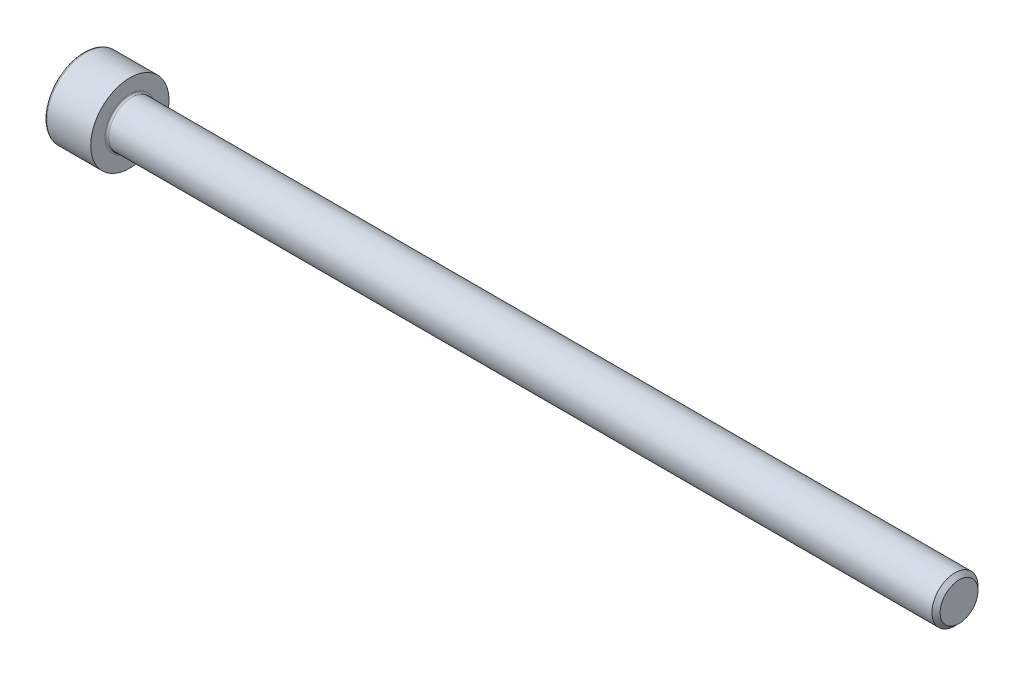
ISO-10303-21;
HEADER;
FILE_DESCRIPTION(('STEP AP214'),'2;1');
FILE_NAME('part.step','',(''),(''),'','','');
FILE_SCHEMA(('AUTOMOTIVE_DESIGN { 1 0 10303 214 1 1 1 1 }'));
ENDSEC;
DATA;
#1=APPLICATION_CONTEXT('core data for automotive mechanical design processes');
#2=APPLICATION_PROTOCOL_DEFINITION('international standard','automotive_design',2000,#1);
#3=PRODUCT_CONTEXT('',#1,'mechanical');
#4=PRODUCT('Part','Part','',(#3));
#5=PRODUCT_RELATED_PRODUCT_CATEGORY('part','',(#4));
#6=PRODUCT_DEFINITION_FORMATION('','',#4);
#7=PRODUCT_DEFINITION_CONTEXT('part definition',#1,'design');
#8=PRODUCT_DEFINITION('design','',#6,#7);
#9=PRODUCT_DEFINITION_SHAPE('','',#8);
#10=(LENGTH_UNIT() NAMED_UNIT(*) SI_UNIT(.MILLI.,.METRE.));
#11=(NAMED_UNIT(*) PLANE_ANGLE_UNIT() SI_UNIT($,.RADIAN.));
#12=(NAMED_UNIT(*) SI_UNIT($,.STERADIAN.) SOLID_ANGLE_UNIT());
#13=UNCERTAINTY_MEASURE_WITH_UNIT(LENGTH_MEASURE(1.E-05),#10,'distance_accuracy_value','');
#14=(GEOMETRIC_REPRESENTATION_CONTEXT(3) GLOBAL_UNCERTAINTY_ASSIGNED_CONTEXT((#13)) GLOBAL_UNIT_ASSIGNED_CONTEXT((#10,
#11,#12)) REPRESENTATION_CONTEXT('',''));
#15=CARTESIAN_POINT('',(0.,0.,0.));
#16=DIRECTION('',(0.,0.,1.));
#17=DIRECTION('',(1.,0.,0.));
#18=AXIS2_PLACEMENT_3D('',#15,#16,#17);
#19=CARTESIAN_POINT('',(0.,0.,0.));
#20=DIRECTION('',(-1.,0.,0.));
#21=DIRECTION('',(0.,0.,1.));
#22=AXIS2_PLACEMENT_3D('',#19,#20,#21);
#23=PLANE('',#22);
#24=DIRECTION('',(0.,-0.499999999999999,0.866025403784439));
#25=VECTOR('',#24,1.);
#26=CARTESIAN_POINT('',(0.,2.35789849937043,0.));
#27=LINE('',#26,#25);
#28=CARTESIAN_POINT('',(0.,2.35789849937043,0.));
#29=VERTEX_POINT('',#28);
#30=CARTESIAN_POINT('',(0.,1.17894924968522,2.042));
#31=VERTEX_POINT('',#30);
#32=EDGE_CURVE('E377',#29,#31,#27,.T.);
#33=ORIENTED_EDGE('',*,*,#32,.T.);
#34=DIRECTION('',(0.,1.,0.));
#35=VECTOR('',#34,1.);
#36=CARTESIAN_POINT('',(0.,-1.17894924968522,2.042));
#37=LINE('',#36,#35);
#38=CARTESIAN_POINT('',(0.,-1.17894924968522,2.042));
#39=VERTEX_POINT('',#38);
#40=EDGE_CURVE('E126',#39,#31,#37,.T.);
#41=ORIENTED_EDGE('',*,*,#40,.F.);
#42=DIRECTION('',(0.,-0.500000000000001,-0.866025403784438));
#43=VECTOR('',#42,1.);
#44=CARTESIAN_POINT('',(0.,-1.17894924968522,2.042));
#45=LINE('',#44,#43);
#46=CARTESIAN_POINT('',(0.,-2.35789849937043,0.));
#47=VERTEX_POINT('',#46);
#48=EDGE_CURVE('E380',#39,#47,#45,.T.);
#49=ORIENTED_EDGE('',*,*,#48,.T.);
#50=DIRECTION('',(0.,0.499999999999999,-0.866025403784439));
#51=VECTOR('',#50,1.);
#52=CARTESIAN_POINT('',(0.,-2.35789849937043,0.));
#53=LINE('',#52,#51);
#54=CARTESIAN_POINT('',(0.,-1.17894924968522,-2.042));
#55=VERTEX_POINT('',#54);
#56=EDGE_CURVE('E383',#47,#55,#53,.T.);
#57=ORIENTED_EDGE('',*,*,#56,.T.);
#58=DIRECTION('',(0.,-1.,0.));
#59=VECTOR('',#58,1.);
#60=CARTESIAN_POINT('',(0.,1.17894924968521,-2.042));
#61=LINE('',#60,#59);
#62=CARTESIAN_POINT('',(0.,1.17894924968521,-2.042));
#63=VERTEX_POINT('',#62);
#64=EDGE_CURVE('E386',#63,#55,#61,.T.);
#65=ORIENTED_EDGE('',*,*,#64,.F.);
#66=DIRECTION('',(0.,-0.500000000000001,-0.866025403784438));
#67=VECTOR('',#66,1.);
#68=CARTESIAN_POINT('',(0.,2.35789849937043,0.));
#69=LINE('',#68,#67);
#70=EDGE_CURVE('E121',#29,#63,#69,.T.);
#71=ORIENTED_EDGE('',*,*,#70,.F.);
#72=EDGE_LOOP('',(#33,#41,#49,#57,#65,#71));
#73=FACE_BOUND('',#72,.T.);
#74=CARTESIAN_POINT('',(0.,0.,0.));
#75=DIRECTION('',(-1.,0.,0.));
#76=DIRECTION('',(0.,0.,1.));
#77=AXIS2_PLACEMENT_3D('',#74,#75,#76);
#78=CIRCLE('',#77,4.);
#79=CARTESIAN_POINT('',(0.,0.,4.));
#80=VERTEX_POINT('',#79);
#81=EDGE_CURVE('E42',#80,#80,#78,.T.);
#82=ORIENTED_EDGE('',*,*,#81,.T.);
#83=EDGE_LOOP('',(#82));
#84=FACE_BOUND('',#83,.T.);
#85=ADVANCED_FACE('F34',(#73,#84),#23,.T.);
#86=CARTESIAN_POINT('',(95.,2.055,0.));
#87=DIRECTION('',(1.,0.,0.));
#88=DIRECTION('',(0.,0.,-1.));
#89=AXIS2_PLACEMENT_3D('',#86,#87,#88);
#90=PLANE('',#89);
#91=CARTESIAN_POINT('',(95.,0.,0.));
#92=DIRECTION('',(-1.,0.,0.));
#93=DIRECTION('',(0.,0.,1.));
#94=AXIS2_PLACEMENT_3D('',#91,#92,#93);
#95=CIRCLE('',#94,2.055);
#96=CARTESIAN_POINT('',(95.,0.,2.055));
#97=VERTEX_POINT('',#96);
#98=EDGE_CURVE('E144',#97,#97,#95,.T.);
#99=ORIENTED_EDGE('',*,*,#98,.F.);
#100=EDGE_LOOP('',(#99));
#101=FACE_BOUND('',#100,.T.);
#102=ADVANCED_FACE('F168',(#101),#90,.T.);
#103=CARTESIAN_POINT('',(95.,0.,0.));
#104=DIRECTION('',(-1.,0.,0.));
#105=DIRECTION('',(0.,0.,1.));
#106=AXIS2_PLACEMENT_3D('',#103,#104,#105);
#107=CONICAL_SURFACE('',#106,2.055,0.78539816339745);
#108=CARTESIAN_POINT('',(94.555,0.,0.));
#109=DIRECTION('',(-1.,0.,0.));
#110=DIRECTION('',(0.,0.,1.));
#111=AXIS2_PLACEMENT_3D('',#108,#109,#110);
#112=CIRCLE('',#111,2.5);
#113=CARTESIAN_POINT('',(94.555,0.,2.5));
#114=VERTEX_POINT('',#113);
#115=EDGE_CURVE('E141',#114,#114,#112,.T.);
#116=ORIENTED_EDGE('',*,*,#115,.F.);
#117=EDGE_LOOP('',(#116));
#118=FACE_BOUND('',#117,.T.);
#119=ORIENTED_EDGE('',*,*,#98,.T.);
#120=EDGE_LOOP('',(#119));
#121=FACE_BOUND('',#120,.T.);
#122=ADVANCED_FACE('F174',(#118,#121),#107,.T.);
#123=CARTESIAN_POINT('',(-31.75,0.,0.));
#124=DIRECTION('',(-1.,0.,0.));
#125=DIRECTION('',(0.,0.,1.));
#126=AXIS2_PLACEMENT_3D('',#123,#124,#125);
#127=CYLINDRICAL_SURFACE('',#126,2.5);
#128=CARTESIAN_POINT('',(5.2,0.,0.));
#129=DIRECTION('',(1.,0.,0.));
#130=DIRECTION('',(0.,0.,-1.));
#131=AXIS2_PLACEMENT_3D('',#128,#129,#130);
#132=CIRCLE('',#131,2.5);
#133=CARTESIAN_POINT('',(5.2,0.,-2.5));
#134=VERTEX_POINT('',#133);
#135=EDGE_CURVE('E150',#134,#134,#132,.T.);
#136=ORIENTED_EDGE('',*,*,#135,.T.);
#137=EDGE_LOOP('',(#136));
#138=FACE_BOUND('',#137,.T.);
#139=ORIENTED_EDGE('',*,*,#115,.T.);
#140=EDGE_LOOP('',(#139));
#141=FACE_BOUND('',#140,.T.);
#142=ADVANCED_FACE('F186',(#138,#141),#127,.T.);
#143=CARTESIAN_POINT('',(5.,4.25,0.));
#144=DIRECTION('',(1.,0.,0.));
#145=DIRECTION('',(0.,0.,-1.));
#146=AXIS2_PLACEMENT_3D('',#143,#144,#145);
#147=PLANE('',#146);
#148=CARTESIAN_POINT('',(5.,0.,0.));
#149=DIRECTION('',(1.,0.,0.));
#150=DIRECTION('',(0.,0.,-1.));
#151=AXIS2_PLACEMENT_3D('',#148,#149,#150);
#152=CIRCLE('',#151,2.7);
#153=CARTESIAN_POINT('',(5.,0.,-2.7));
#154=VERTEX_POINT('',#153);
#155=EDGE_CURVE('E147',#154,#154,#152,.F.);
#156=ORIENTED_EDGE('',*,*,#155,.T.);
#157=EDGE_LOOP('',(#156));
#158=FACE_BOUND('',#157,.T.);
#159=CARTESIAN_POINT('',(5.,0.,0.));
#160=DIRECTION('',(-1.,0.,0.));
#161=DIRECTION('',(0.,0.,1.));
#162=AXIS2_PLACEMENT_3D('',#159,#160,#161);
#163=CIRCLE('',#162,4.25);
#164=CARTESIAN_POINT('',(5.,0.,4.25));
#165=VERTEX_POINT('',#164);
#166=EDGE_CURVE('E137',#165,#165,#163,.T.);
#167=ORIENTED_EDGE('',*,*,#166,.F.);
#168=EDGE_LOOP('',(#167));
#169=FACE_BOUND('',#168,.T.);
#170=ADVANCED_FACE('F182',(#158,#169),#147,.T.);
#171=CARTESIAN_POINT('',(-31.75,0.,0.));
#172=DIRECTION('',(-1.,0.,0.));
#173=DIRECTION('',(0.,0.,1.));
#174=AXIS2_PLACEMENT_3D('',#171,#172,#173);
#175=CYLINDRICAL_SURFACE('',#174,4.25);
#176=CARTESIAN_POINT('',(0.25,0.,0.));
#177=DIRECTION('',(-1.,0.,0.));
#178=DIRECTION('',(0.,0.,1.));
#179=AXIS2_PLACEMENT_3D('',#176,#177,#178);
#180=CIRCLE('',#179,4.25);
#181=CARTESIAN_POINT('',(0.25,0.,4.25));
#182=VERTEX_POINT('',#181);
#183=EDGE_CURVE('E11',#182,#182,#180,.F.);
#184=ORIENTED_EDGE('',*,*,#183,.T.);
#185=EDGE_LOOP('',(#184));
#186=FACE_BOUND('',#185,.T.);
#187=ORIENTED_EDGE('',*,*,#166,.T.);
#188=EDGE_LOOP('',(#187));
#189=FACE_BOUND('',#188,.T.);
#190=ADVANCED_FACE('F164',(#186,#189),#175,.T.);
#191=CARTESIAN_POINT('',(5.2,0.,0.));
#192=DIRECTION('',(1.,0.,0.));
#193=DIRECTION('',(0.,0.,-1.));
#194=AXIS2_PLACEMENT_3D('',#191,#192,#193);
#195=TOROIDAL_SURFACE('',#194,2.7,0.2);
#196=ORIENTED_EDGE('',*,*,#135,.F.);
#197=EDGE_LOOP('',(#196));
#198=FACE_BOUND('',#197,.T.);
#199=ORIENTED_EDGE('',*,*,#155,.F.);
#200=EDGE_LOOP('',(#199));
#201=FACE_BOUND('',#200,.T.);
#202=ADVANCED_FACE('F157',(#198,#201),#195,.F.);
#203=CARTESIAN_POINT('',(0.25,0.,0.));
#204=DIRECTION('',(-1.,0.,0.));
#205=DIRECTION('',(0.,0.,1.));
#206=AXIS2_PLACEMENT_3D('',#203,#204,#205);
#207=TOROIDAL_SURFACE('',#206,4.,0.25);
#208=ORIENTED_EDGE('',*,*,#183,.F.);
#209=EDGE_LOOP('',(#208));
#210=FACE_BOUND('',#209,.T.);
#211=ORIENTED_EDGE('',*,*,#81,.F.);
#212=EDGE_LOOP('',(#211));
#213=FACE_BOUND('',#212,.T.);
#214=ADVANCED_FACE('F36',(#210,#213),#207,.T.);
#215=CARTESIAN_POINT('',(2.5,2.35789849937043,0.));
#216=DIRECTION('',(0.,-0.866025403784439,-0.499999999999999));
#217=DIRECTION('',(0.,0.499999999999999,-0.866025403784439));
#218=AXIS2_PLACEMENT_3D('',#215,#216,#217);
#219=PLANE('',#218);
#220=ORIENTED_EDGE('',*,*,#32,.F.);
#221=DIRECTION('',(-1.,0.,0.));
#222=VECTOR('',#221,1.);
#223=CARTESIAN_POINT('',(2.5,2.35789849937043,0.));
#224=LINE('',#223,#222);
#225=CARTESIAN_POINT('',(2.5,2.35789849937043,0.));
#226=VERTEX_POINT('',#225);
#227=EDGE_CURVE('E376',#226,#29,#224,.T.);
#228=ORIENTED_EDGE('',*,*,#227,.F.);
#229=DIRECTION('',(0.,-0.499999999999999,0.866025403784439));
#230=VECTOR('',#229,1.);
#231=CARTESIAN_POINT('',(2.5,2.35789849937043,0.));
#232=LINE('',#231,#230);
#233=CARTESIAN_POINT('',(2.5,1.76842387452783,1.021));
#234=VERTEX_POINT('',#233);
#235=EDGE_CURVE('E49',#226,#234,#232,.T.);
#236=ORIENTED_EDGE('',*,*,#235,.T.);
#237=CARTESIAN_POINT('',(2.5,1.17894924968522,2.042));
#238=VERTEX_POINT('',#237);
#239=EDGE_CURVE('E107',#234,#238,#232,.T.);
#240=ORIENTED_EDGE('',*,*,#239,.T.);
#241=DIRECTION('',(-1.,0.,0.));
#242=VECTOR('',#241,1.);
#243=CARTESIAN_POINT('',(2.5,1.17894924968522,2.042));
#244=LINE('',#243,#242);
#245=EDGE_CURVE('E119',#238,#31,#244,.T.);
#246=ORIENTED_EDGE('',*,*,#245,.T.);
#247=EDGE_LOOP('',(#220,#228,#236,#240,#246));
#248=FACE_BOUND('',#247,.T.);
#249=ADVANCED_FACE('F118',(#248),#219,.T.);
#250=CARTESIAN_POINT('',(2.5,-1.17894924968522,2.042));
#251=DIRECTION('',(0.,0.,1.));
#252=DIRECTION('',(0.,-1.,0.));
#253=AXIS2_PLACEMENT_3D('',#250,#251,#252);
#254=PLANE('',#253);
#255=ORIENTED_EDGE('',*,*,#40,.T.);
#256=ORIENTED_EDGE('',*,*,#245,.F.);
#257=DIRECTION('',(0.,1.,0.));
#258=VECTOR('',#257,1.);
#259=CARTESIAN_POINT('',(2.5,-1.17894924968522,2.042));
#260=LINE('',#259,#258);
#261=CARTESIAN_POINT('',(2.5,0.,2.042));
#262=VERTEX_POINT('',#261);
#263=EDGE_CURVE('E105',#262,#238,#260,.T.);
#264=ORIENTED_EDGE('',*,*,#263,.F.);
#265=CARTESIAN_POINT('',(2.5,-1.17894924968522,2.042));
#266=VERTEX_POINT('',#265);
#267=EDGE_CURVE('E115',#266,#262,#260,.T.);
#268=ORIENTED_EDGE('',*,*,#267,.F.);
#269=DIRECTION('',(-1.,0.,0.));
#270=VECTOR('',#269,1.);
#271=CARTESIAN_POINT('',(2.5,-1.17894924968522,2.042));
#272=LINE('',#271,#270);
#273=EDGE_CURVE('E128',#266,#39,#272,.T.);
#274=ORIENTED_EDGE('',*,*,#273,.T.);
#275=EDGE_LOOP('',(#255,#256,#264,#268,#274));
#276=FACE_BOUND('',#275,.T.);
#277=ADVANCED_FACE('F123',(#276),#254,.F.);
#278=CARTESIAN_POINT('',(2.5,-1.17894924968522,2.042));
#279=DIRECTION('',(0.,0.866025403784438,-0.500000000000001));
#280=DIRECTION('',(0.,0.500000000000001,0.866025403784438));
#281=AXIS2_PLACEMENT_3D('',#278,#279,#280);
#282=PLANE('',#281);
#283=ORIENTED_EDGE('',*,*,#48,.F.);
#284=ORIENTED_EDGE('',*,*,#273,.F.);
#285=DIRECTION('',(0.,-0.500000000000001,-0.866025403784438));
#286=VECTOR('',#285,1.);
#287=CARTESIAN_POINT('',(2.5,-1.17894924968522,2.042));
#288=LINE('',#287,#286);
#289=CARTESIAN_POINT('',(2.5,-1.76842387452782,1.021));
#290=VERTEX_POINT('',#289);
#291=EDGE_CURVE('E357',#266,#290,#288,.T.);
#292=ORIENTED_EDGE('',*,*,#291,.T.);
#293=CARTESIAN_POINT('',(2.5,-2.35789849937043,0.));
#294=VERTEX_POINT('',#293);
#295=EDGE_CURVE('E359',#290,#294,#288,.T.);
#296=ORIENTED_EDGE('',*,*,#295,.T.);
#297=DIRECTION('',(-1.,0.,0.));
#298=VECTOR('',#297,1.);
#299=CARTESIAN_POINT('',(2.5,-2.35789849937043,0.));
#300=LINE('',#299,#298);
#301=EDGE_CURVE('E133',#294,#47,#300,.T.);
#302=ORIENTED_EDGE('',*,*,#301,.T.);
#303=EDGE_LOOP('',(#283,#284,#292,#296,#302));
#304=FACE_BOUND('',#303,.T.);
#305=ADVANCED_FACE('F249',(#304),#282,.T.);
#306=CARTESIAN_POINT('',(2.5,-2.35789849937043,0.));
#307=DIRECTION('',(0.,0.866025403784439,0.499999999999999));
#308=DIRECTION('',(0.,-0.499999999999999,0.86602540378444));
#309=AXIS2_PLACEMENT_3D('',#306,#307,#308);
#310=PLANE('',#309);
#311=ORIENTED_EDGE('',*,*,#56,.F.);
#312=ORIENTED_EDGE('',*,*,#301,.F.);
#313=DIRECTION('',(0.,0.499999999999999,-0.866025403784439));
#314=VECTOR('',#313,1.);
#315=CARTESIAN_POINT('',(2.5,-2.35789849937043,0.));
#316=LINE('',#315,#314);
#317=CARTESIAN_POINT('',(2.5,-1.76842387452783,-1.021));
#318=VERTEX_POINT('',#317);
#319=EDGE_CURVE('E362',#294,#318,#316,.T.);
#320=ORIENTED_EDGE('',*,*,#319,.T.);
#321=CARTESIAN_POINT('',(2.5,-1.17894924968522,-2.042));
#322=VERTEX_POINT('',#321);
#323=EDGE_CURVE('E366',#318,#322,#316,.T.);
#324=ORIENTED_EDGE('',*,*,#323,.T.);
#325=DIRECTION('',(-1.,0.,0.));
#326=VECTOR('',#325,1.);
#327=CARTESIAN_POINT('',(2.5,-1.17894924968522,-2.042));
#328=LINE('',#327,#326);
#329=EDGE_CURVE('E395',#322,#55,#328,.T.);
#330=ORIENTED_EDGE('',*,*,#329,.T.);
#331=EDGE_LOOP('',(#311,#312,#320,#324,#330));
#332=FACE_BOUND('',#331,.T.);
#333=ADVANCED_FACE('F257',(#332),#310,.T.);
#334=CARTESIAN_POINT('',(2.5,1.17894924968521,-2.042));
#335=DIRECTION('',(0.,0.,-1.));
#336=DIRECTION('',(0.,1.,0.));
#337=AXIS2_PLACEMENT_3D('',#334,#335,#336);
#338=PLANE('',#337);
#339=ORIENTED_EDGE('',*,*,#64,.T.);
#340=ORIENTED_EDGE('',*,*,#329,.F.);
#341=DIRECTION('',(0.,-1.,0.));
#342=VECTOR('',#341,1.);
#343=CARTESIAN_POINT('',(2.5,1.17894924968521,-2.042));
#344=LINE('',#343,#342);
#345=CARTESIAN_POINT('',(2.5,0.,-2.042));
#346=VERTEX_POINT('',#345);
#347=EDGE_CURVE('E370',#346,#322,#344,.T.);
#348=ORIENTED_EDGE('',*,*,#347,.F.);
#349=CARTESIAN_POINT('',(2.5,1.17894924968521,-2.042));
#350=VERTEX_POINT('',#349);
#351=EDGE_CURVE('E371',#350,#346,#344,.T.);
#352=ORIENTED_EDGE('',*,*,#351,.F.);
#353=DIRECTION('',(-1.,0.,0.));
#354=VECTOR('',#353,1.);
#355=CARTESIAN_POINT('',(2.5,1.17894924968521,-2.042));
#356=LINE('',#355,#354);
#357=EDGE_CURVE('E392',#350,#63,#356,.T.);
#358=ORIENTED_EDGE('',*,*,#357,.T.);
#359=EDGE_LOOP('',(#339,#340,#348,#352,#358));
#360=FACE_BOUND('',#359,.T.);
#361=ADVANCED_FACE('F266',(#360),#338,.F.);
#362=CARTESIAN_POINT('',(2.5,2.35789849937043,0.));
#363=DIRECTION('',(0.,0.866025403784438,-0.500000000000001));
#364=DIRECTION('',(0.,0.500000000000001,0.866025403784438));
#365=AXIS2_PLACEMENT_3D('',#362,#363,#364);
#366=PLANE('',#365);
#367=ORIENTED_EDGE('',*,*,#70,.T.);
#368=ORIENTED_EDGE('',*,*,#357,.F.);
#369=DIRECTION('',(0.,-0.500000000000001,-0.866025403784438));
#370=VECTOR('',#369,1.);
#371=CARTESIAN_POINT('',(2.5,2.35789849937043,0.));
#372=LINE('',#371,#370);
#373=CARTESIAN_POINT('',(2.5,1.76842387452782,-1.021));
#374=VERTEX_POINT('',#373);
#375=EDGE_CURVE('E374',#374,#350,#372,.T.);
#376=ORIENTED_EDGE('',*,*,#375,.F.);
#377=EDGE_CURVE('E348',#226,#374,#372,.T.);
#378=ORIENTED_EDGE('',*,*,#377,.F.);
#379=ORIENTED_EDGE('',*,*,#227,.T.);
#380=EDGE_LOOP('',(#367,#368,#376,#378,#379));
#381=FACE_BOUND('',#380,.T.);
#382=ADVANCED_FACE('F275',(#381),#366,.F.);
#383=CARTESIAN_POINT('',(2.5,1.17894924968522,2.042));
#384=DIRECTION('',(-1.,0.,0.));
#385=DIRECTION('',(0.,0.,1.));
#386=AXIS2_PLACEMENT_3D('',#383,#384,#385);
#387=PLANE('',#386);
#388=CARTESIAN_POINT('',(2.5,0.,0.));
#389=DIRECTION('',(-1.,0.,0.));
#390=DIRECTION('',(0.,0.,1.));
#391=AXIS2_PLACEMENT_3D('',#388,#389,#390);
#392=CIRCLE('',#391,2.042);
#393=EDGE_CURVE('E127',#290,#262,#392,.T.);
#394=ORIENTED_EDGE('',*,*,#393,.F.);
#395=ORIENTED_EDGE('',*,*,#291,.F.);
#396=ORIENTED_EDGE('',*,*,#267,.T.);
#397=EDGE_LOOP('',(#394,#395,#396));
#398=FACE_BOUND('',#397,.T.);
#399=ADVANCED_FACE('F284',(#398),#387,.T.);
#400=EDGE_CURVE('E131',#318,#290,#392,.T.);
#401=ORIENTED_EDGE('',*,*,#400,.F.);
#402=ORIENTED_EDGE('',*,*,#319,.F.);
#403=ORIENTED_EDGE('',*,*,#295,.F.);
#404=EDGE_LOOP('',(#401,#402,#403));
#405=FACE_BOUND('',#404,.T.);
#406=ADVANCED_FACE('F293',(#405),#387,.T.);
#407=EDGE_CURVE('E401',#346,#318,#392,.T.);
#408=ORIENTED_EDGE('',*,*,#407,.F.);
#409=ORIENTED_EDGE('',*,*,#347,.T.);
#410=ORIENTED_EDGE('',*,*,#323,.F.);
#411=EDGE_LOOP('',(#408,#409,#410));
#412=FACE_BOUND('',#411,.T.);
#413=ADVANCED_FACE('F302',(#412),#387,.T.);
#414=EDGE_CURVE('E351',#374,#346,#392,.T.);
#415=ORIENTED_EDGE('',*,*,#414,.F.);
#416=ORIENTED_EDGE('',*,*,#375,.T.);
#417=ORIENTED_EDGE('',*,*,#351,.T.);
#418=EDGE_LOOP('',(#415,#416,#417));
#419=FACE_BOUND('',#418,.T.);
#420=ADVANCED_FACE('F310',(#419),#387,.T.);
#421=EDGE_CURVE('E138',#234,#374,#392,.T.);
#422=ORIENTED_EDGE('',*,*,#421,.F.);
#423=ORIENTED_EDGE('',*,*,#235,.F.);
#424=ORIENTED_EDGE('',*,*,#377,.T.);
#425=EDGE_LOOP('',(#422,#423,#424));
#426=FACE_BOUND('',#425,.T.);
#427=ADVANCED_FACE('F318',(#426),#387,.T.);
#428=EDGE_CURVE('E110',#262,#234,#392,.T.);
#429=ORIENTED_EDGE('',*,*,#428,.F.);
#430=ORIENTED_EDGE('',*,*,#263,.T.);
#431=ORIENTED_EDGE('',*,*,#239,.F.);
#432=EDGE_LOOP('',(#429,#430,#431));
#433=FACE_BOUND('',#432,.T.);
#434=ADVANCED_FACE('F106',(#433),#387,.T.);
#435=CARTESIAN_POINT('',(2.5,0.,0.));
#436=DIRECTION('',(-1.,0.,0.));
#437=DIRECTION('',(0.,0.,1.));
#438=AXIS2_PLACEMENT_3D('',#435,#436,#437);
#439=CONICAL_SURFACE('',#438,2.042,1.04719755119659);
#440=CARTESIAN_POINT('',(3.67894924968523,0.,0.));
#441=VERTEX_POINT('',#440);
#442=VERTEX_LOOP('',#441);
#443=FACE_BOUND('',#442,.T.);
#444=ORIENTED_EDGE('',*,*,#428,.T.);
#445=ORIENTED_EDGE('',*,*,#421,.T.);
#446=ORIENTED_EDGE('',*,*,#414,.T.);
#447=ORIENTED_EDGE('',*,*,#407,.T.);
#448=ORIENTED_EDGE('',*,*,#400,.T.);
#449=ORIENTED_EDGE('',*,*,#393,.T.);
#450=EDGE_LOOP('',(#444,#445,#446,#447,#448,#449));
#451=FACE_BOUND('',#450,.T.);
#452=ADVANCED_FACE('F179',(#443,#451),#439,.F.);
#453=CLOSED_SHELL('',(#85,#102,#122,#142,#170,#190,#202,#214,#249,#277,#305,#333,#361,#382,#399,
#406,#413,#420,#427,#434,#452));
#454=MANIFOLD_SOLID_BREP('B2',#453);
#455=ADVANCED_BREP_SHAPE_REPRESENTATION('',(#18,#454),#14);
#456=SHAPE_DEFINITION_REPRESENTATION(#9,#455);
ENDSEC;
END-ISO-10303-21;
